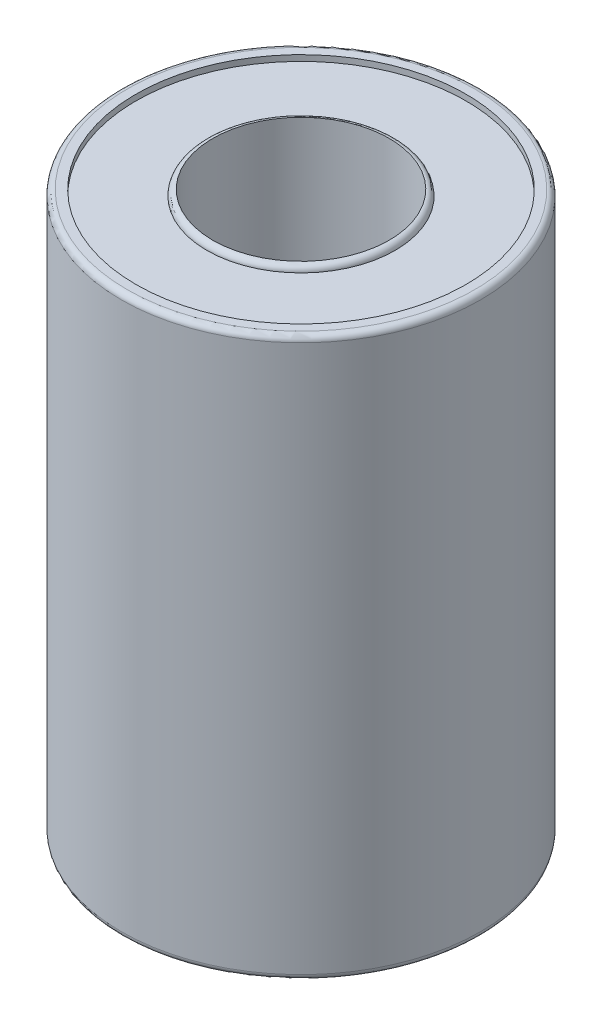
ISO-10303-21;
HEADER;
FILE_DESCRIPTION(('STEP AP214'),'2;1');
FILE_NAME('part.step','',(''),(''),'','','');
FILE_SCHEMA(('AUTOMOTIVE_DESIGN { 1 0 10303 214 1 1 1 1 }'));
ENDSEC;
DATA;
#1=APPLICATION_CONTEXT('core data for automotive mechanical design processes');
#2=APPLICATION_PROTOCOL_DEFINITION('international standard','automotive_design',2000,#1);
#3=PRODUCT_CONTEXT('',#1,'mechanical');
#4=PRODUCT('Part','Part','',(#3));
#5=PRODUCT_RELATED_PRODUCT_CATEGORY('part','',(#4));
#6=PRODUCT_DEFINITION_FORMATION('','',#4);
#7=PRODUCT_DEFINITION_CONTEXT('part definition',#1,'design');
#8=PRODUCT_DEFINITION('design','',#6,#7);
#9=PRODUCT_DEFINITION_SHAPE('','',#8);
#10=(LENGTH_UNIT() NAMED_UNIT(*) SI_UNIT(.MILLI.,.METRE.));
#11=(NAMED_UNIT(*) PLANE_ANGLE_UNIT() SI_UNIT($,.RADIAN.));
#12=(NAMED_UNIT(*) SI_UNIT($,.STERADIAN.) SOLID_ANGLE_UNIT());
#13=UNCERTAINTY_MEASURE_WITH_UNIT(LENGTH_MEASURE(1.E-05),#10,'distance_accuracy_value','');
#14=(GEOMETRIC_REPRESENTATION_CONTEXT(3) GLOBAL_UNCERTAINTY_ASSIGNED_CONTEXT((#13)) GLOBAL_UNIT_ASSIGNED_CONTEXT((#10,
#11,#12)) REPRESENTATION_CONTEXT('',''));
#15=CARTESIAN_POINT('',(0.,0.,0.));
#16=DIRECTION('',(0.,0.,1.));
#17=DIRECTION('',(1.,0.,0.));
#18=AXIS2_PLACEMENT_3D('',#15,#16,#17);
#19=CARTESIAN_POINT('',(0.,19.,0.));
#20=DIRECTION('',(0.,-1.,0.));
#21=DIRECTION('',(0.,0.,-1.));
#22=AXIS2_PLACEMENT_3D('',#19,#20,#21);
#23=CYLINDRICAL_SURFACE('',#22,5.60841722736731);
#24=CARTESIAN_POINT('',(0.,0.,0.));
#25=DIRECTION('',(0.,1.,0.));
#26=DIRECTION('',(0.,0.,1.));
#27=AXIS2_PLACEMENT_3D('',#24,#25,#26);
#28=CIRCLE('',#27,5.60841722736731);
#29=CARTESIAN_POINT('',(0.,0.,5.60841722736731));
#30=VERTEX_POINT('',#29);
#31=EDGE_CURVE('E69',#30,#30,#28,.T.);
#32=ORIENTED_EDGE('',*,*,#31,.F.);
#33=EDGE_LOOP('',(#32));
#34=FACE_BOUND('',#33,.T.);
#35=CARTESIAN_POINT('',(0.,0.199999999999999,0.));
#36=DIRECTION('',(0.,1.,0.));
#37=DIRECTION('',(0.,0.,1.));
#38=AXIS2_PLACEMENT_3D('',#35,#36,#37);
#39=CIRCLE('',#38,5.60841722736731);
#40=CARTESIAN_POINT('',(0.,0.199999999999999,5.60841722736731));
#41=VERTEX_POINT('',#40);
#42=EDGE_CURVE('E63',#41,#41,#39,.F.);
#43=ORIENTED_EDGE('',*,*,#42,.F.);
#44=EDGE_LOOP('',(#43));
#45=FACE_BOUND('',#44,.T.);
#46=ADVANCED_FACE('F39',(#34,#45),#23,.F.);
#47=CARTESIAN_POINT('',(0.,18.8,0.));
#48=DIRECTION('',(0.,1.,0.));
#49=DIRECTION('',(0.,0.,1.));
#50=AXIS2_PLACEMENT_3D('',#47,#48,#49);
#51=CIRCLE('',#50,5.60841722736731);
#52=CARTESIAN_POINT('',(0.,18.8,5.60841722736731));
#53=VERTEX_POINT('',#52);
#54=EDGE_CURVE('E62',#53,#53,#51,.F.);
#55=ORIENTED_EDGE('',*,*,#54,.T.);
#56=EDGE_LOOP('',(#55));
#57=FACE_BOUND('',#56,.T.);
#58=CARTESIAN_POINT('',(0.,19.,0.));
#59=DIRECTION('',(0.,1.,0.));
#60=DIRECTION('',(0.,0.,1.));
#61=AXIS2_PLACEMENT_3D('',#58,#59,#60);
#62=CIRCLE('',#61,5.60841722736731);
#63=CARTESIAN_POINT('',(0.,19.,5.60841722736731));
#64=VERTEX_POINT('',#63);
#65=EDGE_CURVE('E66',#64,#64,#62,.T.);
#66=ORIENTED_EDGE('',*,*,#65,.T.);
#67=EDGE_LOOP('',(#66));
#68=FACE_BOUND('',#67,.T.);
#69=ADVANCED_FACE('F104',(#57,#68),#23,.F.);
#70=CARTESIAN_POINT('',(0.,19.,0.));
#71=DIRECTION('',(0.,-1.,0.));
#72=DIRECTION('',(0.,0.,-1.));
#73=AXIS2_PLACEMENT_3D('',#70,#71,#72);
#74=CYLINDRICAL_SURFACE('',#73,6.10841722736731);
#75=CARTESIAN_POINT('',(0.,0.199999999999999,0.));
#76=DIRECTION('',(0.,1.,0.));
#77=DIRECTION('',(0.,0.,1.));
#78=AXIS2_PLACEMENT_3D('',#75,#76,#77);
#79=CIRCLE('',#78,6.10841722736731);
#80=CARTESIAN_POINT('',(0.,0.199999999999999,6.10841722736731));
#81=VERTEX_POINT('',#80);
#82=EDGE_CURVE('E50',#81,#81,#79,.T.);
#83=ORIENTED_EDGE('',*,*,#82,.T.);
#84=EDGE_LOOP('',(#83));
#85=FACE_BOUND('',#84,.T.);
#86=CARTESIAN_POINT('',(0.,18.8,0.));
#87=DIRECTION('',(0.,1.,0.));
#88=DIRECTION('',(0.,0.,1.));
#89=AXIS2_PLACEMENT_3D('',#86,#87,#88);
#90=CIRCLE('',#89,6.10841722736731);
#91=CARTESIAN_POINT('',(0.,18.8,6.10841722736731));
#92=VERTEX_POINT('',#91);
#93=EDGE_CURVE('E54',#92,#92,#90,.F.);
#94=ORIENTED_EDGE('',*,*,#93,.T.);
#95=EDGE_LOOP('',(#94));
#96=FACE_BOUND('',#95,.T.);
#97=ADVANCED_FACE('F110',(#85,#96),#74,.T.);
#98=CARTESIAN_POINT('',(0.,19.,0.));
#99=DIRECTION('',(0.,1.,0.));
#100=DIRECTION('',(0.,0.,1.));
#101=AXIS2_PLACEMENT_3D('',#98,#99,#100);
#102=PLANE('',#101);
#103=CARTESIAN_POINT('',(0.,19.,0.));
#104=DIRECTION('',(0.,1.,0.));
#105=DIRECTION('',(0.,0.,1.));
#106=AXIS2_PLACEMENT_3D('',#103,#104,#105);
#107=CIRCLE('',#106,5.90841722736731);
#108=CARTESIAN_POINT('',(0.,19.,5.90841722736731));
#109=VERTEX_POINT('',#108);
#110=EDGE_CURVE('E11',#109,#109,#107,.T.);
#111=ORIENTED_EDGE('',*,*,#110,.T.);
#112=EDGE_LOOP('',(#111));
#113=FACE_BOUND('',#112,.T.);
#114=ORIENTED_EDGE('',*,*,#65,.F.);
#115=EDGE_LOOP('',(#114));
#116=FACE_BOUND('',#115,.T.);
#117=ADVANCED_FACE('F148',(#113,#116),#102,.T.);
#118=CARTESIAN_POINT('',(0.,0.,0.));
#119=DIRECTION('',(0.,1.,0.));
#120=DIRECTION('',(0.,0.,1.));
#121=AXIS2_PLACEMENT_3D('',#118,#119,#120);
#122=PLANE('',#121);
#123=CARTESIAN_POINT('',(0.,0.,0.));
#124=DIRECTION('',(0.,1.,0.));
#125=DIRECTION('',(0.,0.,1.));
#126=AXIS2_PLACEMENT_3D('',#123,#124,#125);
#127=CIRCLE('',#126,5.90841722736731);
#128=CARTESIAN_POINT('',(0.,0.,5.90841722736731));
#129=VERTEX_POINT('',#128);
#130=EDGE_CURVE('E46',#129,#129,#127,.F.);
#131=ORIENTED_EDGE('',*,*,#130,.T.);
#132=EDGE_LOOP('',(#131));
#133=FACE_BOUND('',#132,.T.);
#134=ORIENTED_EDGE('',*,*,#31,.T.);
#135=EDGE_LOOP('',(#134));
#136=FACE_BOUND('',#135,.T.);
#137=ADVANCED_FACE('F119',(#133,#136),#122,.F.);
#138=CARTESIAN_POINT('',(0.,18.8,0.));
#139=DIRECTION('',(0.,1.,0.));
#140=DIRECTION('',(0.,0.,1.));
#141=AXIS2_PLACEMENT_3D('',#138,#139,#140);
#142=PLANE('',#141);
#143=CARTESIAN_POINT('',(0.,18.8,0.));
#144=DIRECTION('',(0.,1.,0.));
#145=DIRECTION('',(0.,0.,1.));
#146=AXIS2_PLACEMENT_3D('',#143,#144,#145);
#147=CIRCLE('',#146,3.2);
#148=CARTESIAN_POINT('',(0.,18.8,3.2));
#149=VERTEX_POINT('',#148);
#150=EDGE_CURVE('E72',#149,#149,#147,.F.);
#151=ORIENTED_EDGE('',*,*,#150,.T.);
#152=EDGE_LOOP('',(#151));
#153=FACE_BOUND('',#152,.T.);
#154=ORIENTED_EDGE('',*,*,#54,.F.);
#155=EDGE_LOOP('',(#154));
#156=FACE_BOUND('',#155,.T.);
#157=ADVANCED_FACE('F117',(#153,#156),#142,.T.);
#158=CARTESIAN_POINT('',(0.,0.2,0.));
#159=DIRECTION('',(0.,1.,0.));
#160=DIRECTION('',(0.,0.,1.));
#161=AXIS2_PLACEMENT_3D('',#158,#159,#160);
#162=PLANE('',#161);
#163=CARTESIAN_POINT('',(0.,0.199999999999999,0.));
#164=DIRECTION('',(0.,1.,0.));
#165=DIRECTION('',(0.,0.,1.));
#166=AXIS2_PLACEMENT_3D('',#163,#164,#165);
#167=CIRCLE('',#166,3.2);
#168=CARTESIAN_POINT('',(0.,0.199999999999999,3.2));
#169=VERTEX_POINT('',#168);
#170=EDGE_CURVE('E59',#169,#169,#167,.F.);
#171=ORIENTED_EDGE('',*,*,#170,.F.);
#172=EDGE_LOOP('',(#171));
#173=FACE_BOUND('',#172,.T.);
#174=ORIENTED_EDGE('',*,*,#42,.T.);
#175=EDGE_LOOP('',(#174));
#176=FACE_BOUND('',#175,.T.);
#177=ADVANCED_FACE('F98',(#173,#176),#162,.F.);
#178=CARTESIAN_POINT('',(0.,18.8,0.));
#179=DIRECTION('',(0.,-1.,0.));
#180=DIRECTION('',(0.,0.,-1.));
#181=AXIS2_PLACEMENT_3D('',#178,#179,#180);
#182=CYLINDRICAL_SURFACE('',#181,3.);
#183=CARTESIAN_POINT('',(0.,0.,0.));
#184=DIRECTION('',(0.,1.,0.));
#185=DIRECTION('',(0.,0.,1.));
#186=AXIS2_PLACEMENT_3D('',#183,#184,#185);
#187=CIRCLE('',#186,3.);
#188=CARTESIAN_POINT('',(0.,0.,3.));
#189=VERTEX_POINT('',#188);
#190=EDGE_CURVE('E78',#189,#189,#187,.T.);
#191=ORIENTED_EDGE('',*,*,#190,.F.);
#192=EDGE_LOOP('',(#191));
#193=FACE_BOUND('',#192,.T.);
#194=CARTESIAN_POINT('',(0.,19.,0.));
#195=DIRECTION('',(0.,1.,0.));
#196=DIRECTION('',(0.,0.,1.));
#197=AXIS2_PLACEMENT_3D('',#194,#195,#196);
#198=CIRCLE('',#197,3.);
#199=CARTESIAN_POINT('',(0.,19.,3.));
#200=VERTEX_POINT('',#199);
#201=EDGE_CURVE('E77',#200,#200,#198,.T.);
#202=ORIENTED_EDGE('',*,*,#201,.T.);
#203=EDGE_LOOP('',(#202));
#204=FACE_BOUND('',#203,.T.);
#205=ADVANCED_FACE('F84',(#193,#204),#182,.F.);
#206=CARTESIAN_POINT('',(0.,18.8,0.));
#207=DIRECTION('',(0.,1.,0.));
#208=DIRECTION('',(0.,0.,1.));
#209=AXIS2_PLACEMENT_3D('',#206,#207,#208);
#210=TOROIDAL_SURFACE('',#209,3.,0.2);
#211=ORIENTED_EDGE('',*,*,#150,.F.);
#212=EDGE_LOOP('',(#211));
#213=FACE_BOUND('',#212,.T.);
#214=ORIENTED_EDGE('',*,*,#201,.F.);
#215=EDGE_LOOP('',(#214));
#216=FACE_BOUND('',#215,.T.);
#217=ADVANCED_FACE('F86',(#213,#216),#210,.T.);
#218=CARTESIAN_POINT('',(0.,0.199999999999999,0.));
#219=DIRECTION('',(0.,1.,0.));
#220=DIRECTION('',(0.,0.,1.));
#221=AXIS2_PLACEMENT_3D('',#218,#219,#220);
#222=TOROIDAL_SURFACE('',#221,3.,0.2);
#223=ORIENTED_EDGE('',*,*,#190,.T.);
#224=EDGE_LOOP('',(#223));
#225=FACE_BOUND('',#224,.T.);
#226=ORIENTED_EDGE('',*,*,#170,.T.);
#227=EDGE_LOOP('',(#226));
#228=FACE_BOUND('',#227,.T.);
#229=ADVANCED_FACE('F88',(#225,#228),#222,.T.);
#230=CARTESIAN_POINT('',(0.,0.199999999999999,0.));
#231=DIRECTION('',(0.,1.,0.));
#232=DIRECTION('',(0.,0.,1.));
#233=AXIS2_PLACEMENT_3D('',#230,#231,#232);
#234=TOROIDAL_SURFACE('',#233,5.90841722736731,0.2);
#235=ORIENTED_EDGE('',*,*,#130,.F.);
#236=EDGE_LOOP('',(#235));
#237=FACE_BOUND('',#236,.T.);
#238=ORIENTED_EDGE('',*,*,#82,.F.);
#239=EDGE_LOOP('',(#238));
#240=FACE_BOUND('',#239,.T.);
#241=ADVANCED_FACE('F95',(#237,#240),#234,.T.);
#242=CARTESIAN_POINT('',(0.,18.8,0.));
#243=DIRECTION('',(0.,1.,0.));
#244=DIRECTION('',(0.,0.,1.));
#245=AXIS2_PLACEMENT_3D('',#242,#243,#244);
#246=TOROIDAL_SURFACE('',#245,5.90841722736731,0.2);
#247=ORIENTED_EDGE('',*,*,#93,.F.);
#248=EDGE_LOOP('',(#247));
#249=FACE_BOUND('',#248,.T.);
#250=ORIENTED_EDGE('',*,*,#110,.F.);
#251=EDGE_LOOP('',(#250));
#252=FACE_BOUND('',#251,.T.);
#253=ADVANCED_FACE('F41',(#249,#252),#246,.T.);
#254=CLOSED_SHELL('',(#46,#69,#97,#117,#137,#157,#177,#205,#217,#229,#241,#253));
#255=MANIFOLD_SOLID_BREP('B2',#254);
#256=ADVANCED_BREP_SHAPE_REPRESENTATION('',(#18,#255),#14);
#257=SHAPE_DEFINITION_REPRESENTATION(#9,#256);
ENDSEC;
END-ISO-10303-21;
